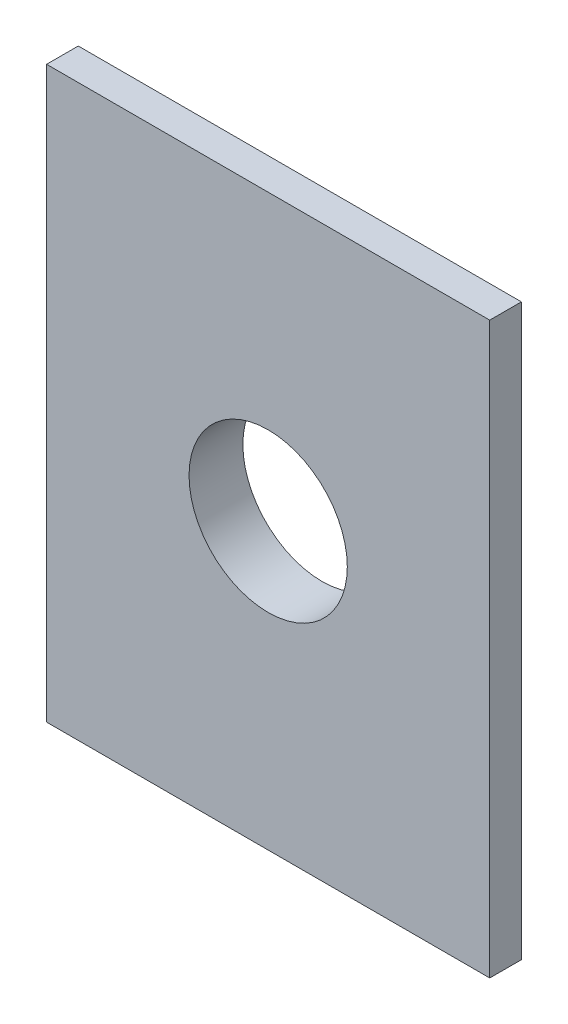
ISO-10303-21;
HEADER;
FILE_DESCRIPTION(('STEP AP214'),'2;1');
FILE_NAME('part.step','',(''),(''),'','','');
FILE_SCHEMA(('AUTOMOTIVE_DESIGN { 1 0 10303 214 1 1 1 1 }'));
ENDSEC;
DATA;
#1=APPLICATION_CONTEXT('core data for automotive mechanical design processes');
#2=APPLICATION_PROTOCOL_DEFINITION('international standard','automotive_design',2000,#1);
#3=PRODUCT_CONTEXT('',#1,'mechanical');
#4=PRODUCT('Part','Part','',(#3));
#5=PRODUCT_RELATED_PRODUCT_CATEGORY('part','',(#4));
#6=PRODUCT_DEFINITION_FORMATION('','',#4);
#7=PRODUCT_DEFINITION_CONTEXT('part definition',#1,'design');
#8=PRODUCT_DEFINITION('design','',#6,#7);
#9=PRODUCT_DEFINITION_SHAPE('','',#8);
#10=(LENGTH_UNIT() NAMED_UNIT(*) SI_UNIT(.MILLI.,.METRE.));
#11=(NAMED_UNIT(*) PLANE_ANGLE_UNIT() SI_UNIT($,.RADIAN.));
#12=(NAMED_UNIT(*) SI_UNIT($,.STERADIAN.) SOLID_ANGLE_UNIT());
#13=UNCERTAINTY_MEASURE_WITH_UNIT(LENGTH_MEASURE(1.E-05),#10,'distance_accuracy_value','');
#14=(GEOMETRIC_REPRESENTATION_CONTEXT(3) GLOBAL_UNCERTAINTY_ASSIGNED_CONTEXT((#13)) GLOBAL_UNIT_ASSIGNED_CONTEXT((#10,
#11,#12)) REPRESENTATION_CONTEXT('',''));
#15=CARTESIAN_POINT('',(0.,0.,0.));
#16=DIRECTION('',(0.,0.,1.));
#17=DIRECTION('',(1.,0.,0.));
#18=AXIS2_PLACEMENT_3D('',#15,#16,#17);
#19=CARTESIAN_POINT('',(0.,0.,0.));
#20=DIRECTION('',(0.,0.,1.));
#21=DIRECTION('',(1.,0.,0.));
#22=AXIS2_PLACEMENT_3D('',#19,#20,#21);
#23=PLANE('',#22);
#24=DIRECTION('',(1.,0.,0.));
#25=VECTOR('',#24,1.);
#26=CARTESIAN_POINT('',(0.,0.,0.));
#27=LINE('',#26,#25);
#28=CARTESIAN_POINT('',(0.,0.,0.));
#29=VERTEX_POINT('',#28);
#30=CARTESIAN_POINT('',(140.,0.,0.));
#31=VERTEX_POINT('',#30);
#32=EDGE_CURVE('E94',#29,#31,#27,.T.);
#33=ORIENTED_EDGE('',*,*,#32,.F.);
#34=DIRECTION('',(0.,-1.,0.));
#35=VECTOR('',#34,1.);
#36=CARTESIAN_POINT('',(0.,180.,0.));
#37=LINE('',#36,#35);
#38=CARTESIAN_POINT('',(0.,180.,0.));
#39=VERTEX_POINT('',#38);
#40=EDGE_CURVE('E109',#39,#29,#37,.T.);
#41=ORIENTED_EDGE('',*,*,#40,.F.);
#42=DIRECTION('',(-1.,0.,0.));
#43=VECTOR('',#42,1.);
#44=CARTESIAN_POINT('',(140.,180.,0.));
#45=LINE('',#44,#43);
#46=CARTESIAN_POINT('',(140.,180.,0.));
#47=VERTEX_POINT('',#46);
#48=EDGE_CURVE('E78',#47,#39,#45,.T.);
#49=ORIENTED_EDGE('',*,*,#48,.F.);
#50=DIRECTION('',(0.,1.,0.));
#51=VECTOR('',#50,1.);
#52=CARTESIAN_POINT('',(140.,0.,0.));
#53=LINE('',#52,#51);
#54=EDGE_CURVE('E71',#31,#47,#53,.T.);
#55=ORIENTED_EDGE('',*,*,#54,.F.);
#56=EDGE_LOOP('',(#33,#41,#49,#55));
#57=FACE_BOUND('',#56,.T.);
#58=CARTESIAN_POINT('',(70.,90.,0.));
#59=DIRECTION('',(0.,0.,1.));
#60=DIRECTION('',(1.,0.,0.));
#61=AXIS2_PLACEMENT_3D('',#58,#59,#60);
#62=CIRCLE('',#61,35.);
#63=CARTESIAN_POINT('',(105.,90.,0.));
#64=VERTEX_POINT('',#63);
#65=EDGE_CURVE('E11',#64,#64,#62,.F.);
#66=ORIENTED_EDGE('',*,*,#65,.F.);
#67=EDGE_LOOP('',(#66));
#68=FACE_BOUND('',#67,.T.);
#69=ADVANCED_FACE('F36',(#57,#68),#23,.F.);
#70=CARTESIAN_POINT('',(0.,0.,10.));
#71=DIRECTION('',(0.,0.,1.));
#72=DIRECTION('',(1.,0.,0.));
#73=AXIS2_PLACEMENT_3D('',#70,#71,#72);
#74=PLANE('',#73);
#75=DIRECTION('',(0.,-1.,0.));
#76=VECTOR('',#75,1.);
#77=CARTESIAN_POINT('',(0.,49.1776660687769,10.));
#78=LINE('',#77,#76);
#79=CARTESIAN_POINT('',(0.,180.,10.));
#80=VERTEX_POINT('',#79);
#81=CARTESIAN_POINT('',(0.,0.,10.));
#82=VERTEX_POINT('',#81);
#83=EDGE_CURVE('E53',#80,#82,#78,.T.);
#84=ORIENTED_EDGE('',*,*,#83,.T.);
#85=DIRECTION('',(1.,0.,0.));
#86=VECTOR('',#85,1.);
#87=CARTESIAN_POINT('',(0.,0.,10.));
#88=LINE('',#87,#86);
#89=CARTESIAN_POINT('',(140.,0.,10.));
#90=VERTEX_POINT('',#89);
#91=EDGE_CURVE('E85',#82,#90,#88,.T.);
#92=ORIENTED_EDGE('',*,*,#91,.T.);
#93=DIRECTION('',(0.,1.,0.));
#94=VECTOR('',#93,1.);
#95=CARTESIAN_POINT('',(140.,0.,10.));
#96=LINE('',#95,#94);
#97=CARTESIAN_POINT('',(140.,180.,10.));
#98=VERTEX_POINT('',#97);
#99=EDGE_CURVE('E90',#90,#98,#96,.T.);
#100=ORIENTED_EDGE('',*,*,#99,.T.);
#101=DIRECTION('',(-1.,0.,0.));
#102=VECTOR('',#101,1.);
#103=CARTESIAN_POINT('',(140.,180.,10.));
#104=LINE('',#103,#102);
#105=EDGE_CURVE('E99',#98,#80,#104,.T.);
#106=ORIENTED_EDGE('',*,*,#105,.T.);
#107=EDGE_LOOP('',(#84,#92,#100,#106));
#108=FACE_BOUND('',#107,.T.);
#109=CARTESIAN_POINT('',(70.,90.,10.));
#110=DIRECTION('',(0.,0.,1.));
#111=DIRECTION('',(1.,0.,0.));
#112=AXIS2_PLACEMENT_3D('',#109,#110,#111);
#113=CIRCLE('',#112,25.);
#114=CARTESIAN_POINT('',(95.,90.,10.));
#115=VERTEX_POINT('',#114);
#116=EDGE_CURVE('E106',#115,#115,#113,.T.);
#117=ORIENTED_EDGE('',*,*,#116,.F.);
#118=EDGE_LOOP('',(#117));
#119=FACE_BOUND('',#118,.T.);
#120=ADVANCED_FACE('F87',(#108,#119),#74,.T.);
#121=CARTESIAN_POINT('',(0.,0.,10.));
#122=DIRECTION('',(0.,1.,0.));
#123=DIRECTION('',(0.,0.,1.));
#124=AXIS2_PLACEMENT_3D('',#121,#122,#123);
#125=PLANE('',#124);
#126=ORIENTED_EDGE('',*,*,#32,.T.);
#127=DIRECTION('',(0.,0.,-1.));
#128=VECTOR('',#127,1.);
#129=CARTESIAN_POINT('',(140.,0.,10.));
#130=LINE('',#129,#128);
#131=EDGE_CURVE('E92',#90,#31,#130,.T.);
#132=ORIENTED_EDGE('',*,*,#131,.F.);
#133=ORIENTED_EDGE('',*,*,#91,.F.);
#134=DIRECTION('',(0.,0.,-1.));
#135=VECTOR('',#134,1.);
#136=CARTESIAN_POINT('',(0.,0.,10.));
#137=LINE('',#136,#135);
#138=EDGE_CURVE('E45',#82,#29,#137,.T.);
#139=ORIENTED_EDGE('',*,*,#138,.T.);
#140=EDGE_LOOP('',(#126,#132,#133,#139));
#141=FACE_BOUND('',#140,.T.);
#142=ADVANCED_FACE('F38',(#141),#125,.F.);
#143=CARTESIAN_POINT('',(140.,0.,10.));
#144=DIRECTION('',(-1.,0.,0.));
#145=DIRECTION('',(0.,0.,1.));
#146=AXIS2_PLACEMENT_3D('',#143,#144,#145);
#147=PLANE('',#146);
#148=ORIENTED_EDGE('',*,*,#54,.T.);
#149=DIRECTION('',(0.,0.,-1.));
#150=VECTOR('',#149,1.);
#151=CARTESIAN_POINT('',(140.,180.,10.));
#152=LINE('',#151,#150);
#153=EDGE_CURVE('E95',#98,#47,#152,.T.);
#154=ORIENTED_EDGE('',*,*,#153,.F.);
#155=ORIENTED_EDGE('',*,*,#99,.F.);
#156=ORIENTED_EDGE('',*,*,#131,.T.);
#157=EDGE_LOOP('',(#148,#154,#155,#156));
#158=FACE_BOUND('',#157,.T.);
#159=ADVANCED_FACE('F97',(#158),#147,.F.);
#160=CARTESIAN_POINT('',(140.,180.,10.));
#161=DIRECTION('',(0.,-1.,0.));
#162=DIRECTION('',(0.,0.,-1.));
#163=AXIS2_PLACEMENT_3D('',#160,#161,#162);
#164=PLANE('',#163);
#165=ORIENTED_EDGE('',*,*,#48,.T.);
#166=DIRECTION('',(0.,0.,-1.));
#167=VECTOR('',#166,1.);
#168=CARTESIAN_POINT('',(0.,180.,10.));
#169=LINE('',#168,#167);
#170=EDGE_CURVE('E101',#80,#39,#169,.T.);
#171=ORIENTED_EDGE('',*,*,#170,.F.);
#172=ORIENTED_EDGE('',*,*,#105,.F.);
#173=ORIENTED_EDGE('',*,*,#153,.T.);
#174=EDGE_LOOP('',(#165,#171,#172,#173));
#175=FACE_BOUND('',#174,.T.);
#176=ADVANCED_FACE('F140',(#175),#164,.F.);
#177=CARTESIAN_POINT('',(0.,180.,10.));
#178=DIRECTION('',(1.,0.,0.));
#179=DIRECTION('',(0.,1.,0.));
#180=AXIS2_PLACEMENT_3D('',#177,#178,#179);
#181=PLANE('',#180);
#182=ORIENTED_EDGE('',*,*,#40,.T.);
#183=ORIENTED_EDGE('',*,*,#138,.F.);
#184=ORIENTED_EDGE('',*,*,#83,.F.);
#185=ORIENTED_EDGE('',*,*,#170,.T.);
#186=EDGE_LOOP('',(#182,#183,#184,#185));
#187=FACE_BOUND('',#186,.T.);
#188=ADVANCED_FACE('F112',(#187),#181,.F.);
#189=CARTESIAN_POINT('',(70.,90.,-98.9949493661167));
#190=DIRECTION('',(0.,0.,1.));
#191=DIRECTION('',(1.,0.,0.));
#192=AXIS2_PLACEMENT_3D('',#189,#190,#191);
#193=CYLINDRICAL_SURFACE('',#192,25.);
#194=ORIENTED_EDGE('',*,*,#116,.T.);
#195=EDGE_LOOP('',(#194));
#196=FACE_BOUND('',#195,.T.);
#197=CARTESIAN_POINT('',(70.,90.,-7.));
#198=DIRECTION('',(0.,0.,-1.));
#199=DIRECTION('',(-1.,0.,0.));
#200=AXIS2_PLACEMENT_3D('',#197,#198,#199);
#201=CIRCLE('',#200,25.);
#202=CARTESIAN_POINT('',(45.,90.,-7.));
#203=VERTEX_POINT('',#202);
#204=EDGE_CURVE('E213',#203,#203,#201,.T.);
#205=ORIENTED_EDGE('',*,*,#204,.T.);
#206=EDGE_LOOP('',(#205));
#207=FACE_BOUND('',#206,.T.);
#208=ADVANCED_FACE('F128',(#196,#207),#193,.F.);
#209=CARTESIAN_POINT('',(70.,90.,-7.));
#210=DIRECTION('',(0.,0.,-1.));
#211=DIRECTION('',(-1.,0.,0.));
#212=AXIS2_PLACEMENT_3D('',#209,#210,#211);
#213=PLANE('',#212);
#214=CARTESIAN_POINT('',(70.,90.,-7.));
#215=DIRECTION('',(0.,0.,-1.));
#216=DIRECTION('',(-1.,0.,0.));
#217=AXIS2_PLACEMENT_3D('',#214,#215,#216);
#218=CIRCLE('',#217,35.);
#219=CARTESIAN_POINT('',(35.,90.,-7.));
#220=VERTEX_POINT('',#219);
#221=EDGE_CURVE('E215',#220,#220,#218,.T.);
#222=ORIENTED_EDGE('',*,*,#221,.T.);
#223=EDGE_LOOP('',(#222));
#224=FACE_BOUND('',#223,.T.);
#225=ORIENTED_EDGE('',*,*,#204,.F.);
#226=EDGE_LOOP('',(#225));
#227=FACE_BOUND('',#226,.T.);
#228=ADVANCED_FACE('F122',(#224,#227),#213,.T.);
#229=CARTESIAN_POINT('',(70.,90.,-7.));
#230=DIRECTION('',(0.,0.,1.));
#231=DIRECTION('',(1.,0.,0.));
#232=AXIS2_PLACEMENT_3D('',#229,#230,#231);
#233=CYLINDRICAL_SURFACE('',#232,35.);
#234=ORIENTED_EDGE('',*,*,#221,.F.);
#235=EDGE_LOOP('',(#234));
#236=FACE_BOUND('',#235,.T.);
#237=ORIENTED_EDGE('',*,*,#65,.T.);
#238=EDGE_LOOP('',(#237));
#239=FACE_BOUND('',#238,.T.);
#240=ADVANCED_FACE('F120',(#236,#239),#233,.T.);
#241=CLOSED_SHELL('',(#69,#120,#142,#159,#176,#188,#208,#228,#240));
#242=MANIFOLD_SOLID_BREP('B2',#241);
#243=ADVANCED_BREP_SHAPE_REPRESENTATION('',(#18,#242),#14);
#244=SHAPE_DEFINITION_REPRESENTATION(#9,#243);
ENDSEC;
END-ISO-10303-21;
